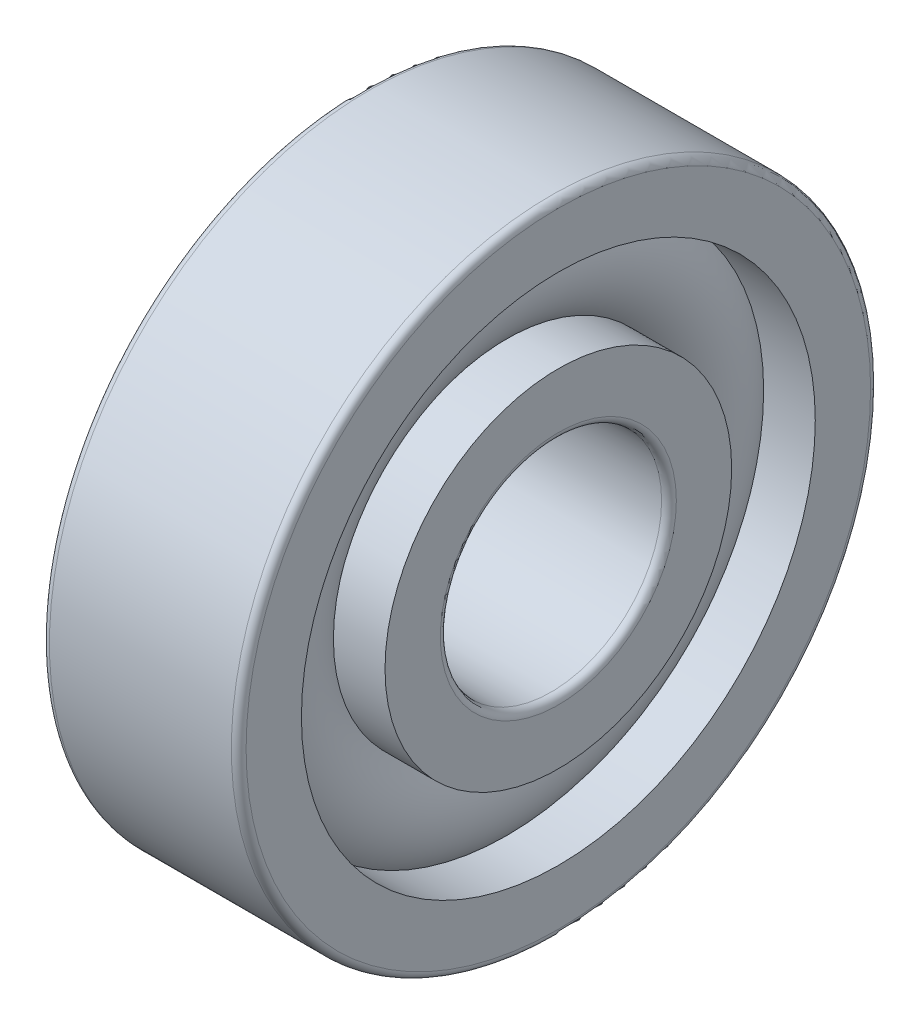
ISO-10303-21;
HEADER;
FILE_DESCRIPTION(('STEP AP214'),'2;1');
FILE_NAME('part.step','',(''),(''),'','','');
FILE_SCHEMA(('AUTOMOTIVE_DESIGN { 1 0 10303 214 1 1 1 1 }'));
ENDSEC;
DATA;
#1=APPLICATION_CONTEXT('core data for automotive mechanical design processes');
#2=APPLICATION_PROTOCOL_DEFINITION('international standard','automotive_design',2000,#1);
#3=PRODUCT_CONTEXT('',#1,'mechanical');
#4=PRODUCT('Part','Part','',(#3));
#5=PRODUCT_RELATED_PRODUCT_CATEGORY('part','',(#4));
#6=PRODUCT_DEFINITION_FORMATION('','',#4);
#7=PRODUCT_DEFINITION_CONTEXT('part definition',#1,'design');
#8=PRODUCT_DEFINITION('design','',#6,#7);
#9=PRODUCT_DEFINITION_SHAPE('','',#8);
#10=(LENGTH_UNIT() NAMED_UNIT(*) SI_UNIT(.MILLI.,.METRE.));
#11=(NAMED_UNIT(*) PLANE_ANGLE_UNIT() SI_UNIT($,.RADIAN.));
#12=(NAMED_UNIT(*) SI_UNIT($,.STERADIAN.) SOLID_ANGLE_UNIT());
#13=UNCERTAINTY_MEASURE_WITH_UNIT(LENGTH_MEASURE(1.E-05),#10,'distance_accuracy_value','');
#14=(GEOMETRIC_REPRESENTATION_CONTEXT(3) GLOBAL_UNCERTAINTY_ASSIGNED_CONTEXT((#13)) GLOBAL_UNIT_ASSIGNED_CONTEXT((#10,
#11,#12)) REPRESENTATION_CONTEXT('',''));
#15=CARTESIAN_POINT('',(0.,0.,0.));
#16=DIRECTION('',(0.,0.,1.));
#17=DIRECTION('',(1.,0.,0.));
#18=AXIS2_PLACEMENT_3D('',#15,#16,#17);
#19=CARTESIAN_POINT('',(0.,0.,0.));
#20=DIRECTION('',(-1.,0.,0.));
#21=DIRECTION('',(0.,0.,1.));
#22=AXIS2_PLACEMENT_3D('',#19,#20,#21);
#23=TOROIDAL_SURFACE('',#22,8.75,2.55);
#24=CARTESIAN_POINT('',(1.90065778087482,0.,0.));
#25=DIRECTION('',(-1.,0.,0.));
#26=DIRECTION('',(0.,0.,1.));
#27=AXIS2_PLACEMENT_3D('',#24,#25,#26);
#28=CIRCLE('',#27,10.45);
#29=CARTESIAN_POINT('',(1.90065778087482,0.,10.45));
#30=VERTEX_POINT('',#29);
#31=EDGE_CURVE('E45',#30,#30,#28,.F.);
#32=ORIENTED_EDGE('',*,*,#31,.T.);
#33=EDGE_LOOP('',(#32));
#34=FACE_BOUND('',#33,.T.);
#35=CARTESIAN_POINT('',(1.90065778087482,0.,0.));
#36=DIRECTION('',(-1.,0.,0.));
#37=DIRECTION('',(0.,0.,1.));
#38=AXIS2_PLACEMENT_3D('',#35,#36,#37);
#39=CIRCLE('',#38,7.05);
#40=CARTESIAN_POINT('',(1.90065778087482,0.,7.05));
#41=VERTEX_POINT('',#40);
#42=EDGE_CURVE('E10',#41,#41,#39,.T.);
#43=ORIENTED_EDGE('',*,*,#42,.T.);
#44=EDGE_LOOP('',(#43));
#45=FACE_BOUND('',#44,.T.);
#46=ADVANCED_FACE('F41',(#34,#45),#23,.T.);
#47=CARTESIAN_POINT('',(-20.6375,0.,0.));
#48=DIRECTION('',(1.,0.,0.));
#49=DIRECTION('',(0.,0.,-1.));
#50=AXIS2_PLACEMENT_3D('',#47,#48,#49);
#51=CYLINDRICAL_SURFACE('',#50,7.05);
#52=CARTESIAN_POINT('',(4.,0.,0.));
#53=DIRECTION('',(1.,0.,0.));
#54=DIRECTION('',(0.,0.,-1.));
#55=AXIS2_PLACEMENT_3D('',#52,#53,#54);
#56=CIRCLE('',#55,7.05);
#57=CARTESIAN_POINT('',(4.,0.,-7.05));
#58=VERTEX_POINT('',#57);
#59=EDGE_CURVE('E56',#58,#58,#56,.T.);
#60=ORIENTED_EDGE('',*,*,#59,.F.);
#61=EDGE_LOOP('',(#60));
#62=FACE_BOUND('',#61,.T.);
#63=ORIENTED_EDGE('',*,*,#42,.F.);
#64=EDGE_LOOP('',(#63));
#65=FACE_BOUND('',#64,.T.);
#66=ADVANCED_FACE('F105',(#62,#65),#51,.T.);
#67=CARTESIAN_POINT('',(-20.6375,0.,0.));
#68=DIRECTION('',(1.,0.,0.));
#69=DIRECTION('',(0.,0.,-1.));
#70=AXIS2_PLACEMENT_3D('',#67,#68,#69);
#71=CYLINDRICAL_SURFACE('',#70,7.05);
#72=CARTESIAN_POINT('',(-4.,0.,0.));
#73=DIRECTION('',(1.,0.,0.));
#74=DIRECTION('',(0.,0.,-1.));
#75=AXIS2_PLACEMENT_3D('',#72,#73,#74);
#76=CIRCLE('',#75,7.05);
#77=CARTESIAN_POINT('',(-4.,0.,-7.05));
#78=VERTEX_POINT('',#77);
#79=EDGE_CURVE('E68',#78,#78,#76,.T.);
#80=ORIENTED_EDGE('',*,*,#79,.T.);
#81=EDGE_LOOP('',(#80));
#82=FACE_BOUND('',#81,.T.);
#83=CARTESIAN_POINT('',(-1.90065778087482,0.,0.));
#84=DIRECTION('',(1.,0.,0.));
#85=DIRECTION('',(0.,0.,-1.));
#86=AXIS2_PLACEMENT_3D('',#83,#84,#85);
#87=CIRCLE('',#86,7.05);
#88=CARTESIAN_POINT('',(-1.90065778087482,0.,-7.05));
#89=VERTEX_POINT('',#88);
#90=EDGE_CURVE('E50',#89,#89,#87,.T.);
#91=ORIENTED_EDGE('',*,*,#90,.F.);
#92=EDGE_LOOP('',(#91));
#93=FACE_BOUND('',#92,.T.);
#94=ADVANCED_FACE('F108',(#82,#93),#71,.T.);
#95=CARTESIAN_POINT('',(4.,4.8,0.));
#96=DIRECTION('',(1.,0.,0.));
#97=DIRECTION('',(0.,0.,-1.));
#98=AXIS2_PLACEMENT_3D('',#95,#96,#97);
#99=PLANE('',#98);
#100=ORIENTED_EDGE('',*,*,#59,.T.);
#101=EDGE_LOOP('',(#100));
#102=FACE_BOUND('',#101,.T.);
#103=CARTESIAN_POINT('',(4.,0.,0.));
#104=DIRECTION('',(1.,0.,0.));
#105=DIRECTION('',(0.,0.,-1.));
#106=AXIS2_PLACEMENT_3D('',#103,#104,#105);
#107=CIRCLE('',#106,4.8);
#108=CARTESIAN_POINT('',(4.,0.,-4.8));
#109=VERTEX_POINT('',#108);
#110=EDGE_CURVE('E95',#109,#109,#107,.T.);
#111=ORIENTED_EDGE('',*,*,#110,.F.);
#112=EDGE_LOOP('',(#111));
#113=FACE_BOUND('',#112,.T.);
#114=ADVANCED_FACE('F102',(#102,#113),#99,.T.);
#115=CARTESIAN_POINT('',(3.7,0.,0.));
#116=DIRECTION('',(1.,0.,0.));
#117=DIRECTION('',(0.,0.,-1.));
#118=AXIS2_PLACEMENT_3D('',#115,#116,#117);
#119=TOROIDAL_SURFACE('',#118,4.8,0.299999999999999);
#120=ORIENTED_EDGE('',*,*,#110,.T.);
#121=EDGE_LOOP('',(#120));
#122=FACE_BOUND('',#121,.T.);
#123=CARTESIAN_POINT('',(3.7,0.,0.));
#124=DIRECTION('',(1.,0.,0.));
#125=DIRECTION('',(0.,0.,-1.));
#126=AXIS2_PLACEMENT_3D('',#123,#124,#125);
#127=CIRCLE('',#126,4.5);
#128=CARTESIAN_POINT('',(3.7,0.,-4.5));
#129=VERTEX_POINT('',#128);
#130=EDGE_CURVE('E91',#129,#129,#127,.T.);
#131=ORIENTED_EDGE('',*,*,#130,.F.);
#132=EDGE_LOOP('',(#131));
#133=FACE_BOUND('',#132,.T.);
#134=ADVANCED_FACE('F119',(#122,#133),#119,.T.);
#135=CARTESIAN_POINT('',(-20.6375,0.,0.));
#136=DIRECTION('',(1.,0.,0.));
#137=DIRECTION('',(0.,0.,-1.));
#138=AXIS2_PLACEMENT_3D('',#135,#136,#137);
#139=CYLINDRICAL_SURFACE('',#138,4.5);
#140=ORIENTED_EDGE('',*,*,#130,.T.);
#141=EDGE_LOOP('',(#140));
#142=FACE_BOUND('',#141,.T.);
#143=CARTESIAN_POINT('',(-3.7,0.,0.));
#144=DIRECTION('',(1.,0.,0.));
#145=DIRECTION('',(0.,0.,-1.));
#146=AXIS2_PLACEMENT_3D('',#143,#144,#145);
#147=CIRCLE('',#146,4.5);
#148=CARTESIAN_POINT('',(-3.7,0.,-4.5));
#149=VERTEX_POINT('',#148);
#150=EDGE_CURVE('E87',#149,#149,#147,.T.);
#151=ORIENTED_EDGE('',*,*,#150,.F.);
#152=EDGE_LOOP('',(#151));
#153=FACE_BOUND('',#152,.T.);
#154=ADVANCED_FACE('F122',(#142,#153),#139,.F.);
#155=CARTESIAN_POINT('',(-3.7,0.,0.));
#156=DIRECTION('',(1.,0.,0.));
#157=DIRECTION('',(0.,0.,-1.));
#158=AXIS2_PLACEMENT_3D('',#155,#156,#157);
#159=TOROIDAL_SURFACE('',#158,4.8,0.299999999999999);
#160=ORIENTED_EDGE('',*,*,#150,.T.);
#161=EDGE_LOOP('',(#160));
#162=FACE_BOUND('',#161,.T.);
#163=CARTESIAN_POINT('',(-4.,0.,0.));
#164=DIRECTION('',(1.,0.,0.));
#165=DIRECTION('',(0.,0.,-1.));
#166=AXIS2_PLACEMENT_3D('',#163,#164,#165);
#167=CIRCLE('',#166,4.8);
#168=CARTESIAN_POINT('',(-4.,0.,-4.8));
#169=VERTEX_POINT('',#168);
#170=EDGE_CURVE('E83',#169,#169,#167,.T.);
#171=ORIENTED_EDGE('',*,*,#170,.F.);
#172=EDGE_LOOP('',(#171));
#173=FACE_BOUND('',#172,.T.);
#174=ADVANCED_FACE('F126',(#162,#173),#159,.T.);
#175=CARTESIAN_POINT('',(-4.,7.05,0.));
#176=DIRECTION('',(-1.,0.,0.));
#177=DIRECTION('',(0.,0.,1.));
#178=AXIS2_PLACEMENT_3D('',#175,#176,#177);
#179=PLANE('',#178);
#180=ORIENTED_EDGE('',*,*,#170,.T.);
#181=EDGE_LOOP('',(#180));
#182=FACE_BOUND('',#181,.T.);
#183=ORIENTED_EDGE('',*,*,#79,.F.);
#184=EDGE_LOOP('',(#183));
#185=FACE_BOUND('',#184,.T.);
#186=ADVANCED_FACE('F130',(#182,#185),#179,.T.);
#187=CARTESIAN_POINT('',(-1.90065778087482,0.,0.));
#188=DIRECTION('',(1.,0.,0.));
#189=DIRECTION('',(0.,0.,-1.));
#190=AXIS2_PLACEMENT_3D('',#187,#188,#189);
#191=CIRCLE('',#190,10.45);
#192=CARTESIAN_POINT('',(-1.90065778087482,0.,-10.45));
#193=VERTEX_POINT('',#192);
#194=EDGE_CURVE('E59',#193,#193,#191,.F.);
#195=ORIENTED_EDGE('',*,*,#194,.T.);
#196=EDGE_LOOP('',(#195));
#197=FACE_BOUND('',#196,.T.);
#198=ORIENTED_EDGE('',*,*,#90,.T.);
#199=EDGE_LOOP('',(#198));
#200=FACE_BOUND('',#199,.T.);
#201=ADVANCED_FACE('F43',(#197,#200),#23,.T.);
#202=CARTESIAN_POINT('',(-20.6375,0.,0.));
#203=DIRECTION('',(1.,0.,0.));
#204=DIRECTION('',(0.,0.,-1.));
#205=AXIS2_PLACEMENT_3D('',#202,#203,#204);
#206=CYLINDRICAL_SURFACE('',#205,10.45);
#207=CARTESIAN_POINT('',(4.,0.,0.));
#208=DIRECTION('',(1.,0.,0.));
#209=DIRECTION('',(0.,0.,-1.));
#210=AXIS2_PLACEMENT_3D('',#207,#208,#209);
#211=CIRCLE('',#210,10.45);
#212=CARTESIAN_POINT('',(4.,0.,-10.45));
#213=VERTEX_POINT('',#212);
#214=EDGE_CURVE('E62',#213,#213,#211,.T.);
#215=ORIENTED_EDGE('',*,*,#214,.T.);
#216=EDGE_LOOP('',(#215));
#217=FACE_BOUND('',#216,.T.);
#218=ORIENTED_EDGE('',*,*,#31,.F.);
#219=EDGE_LOOP('',(#218));
#220=FACE_BOUND('',#219,.T.);
#221=ADVANCED_FACE('F135',(#217,#220),#206,.F.);
#222=CARTESIAN_POINT('',(-20.6375,0.,0.));
#223=DIRECTION('',(1.,0.,0.));
#224=DIRECTION('',(0.,0.,-1.));
#225=AXIS2_PLACEMENT_3D('',#222,#223,#224);
#226=CYLINDRICAL_SURFACE('',#225,10.45);
#227=CARTESIAN_POINT('',(-4.,0.,0.));
#228=DIRECTION('',(1.,0.,0.));
#229=DIRECTION('',(0.,0.,-1.));
#230=AXIS2_PLACEMENT_3D('',#227,#228,#229);
#231=CIRCLE('',#230,10.45);
#232=CARTESIAN_POINT('',(-4.,0.,-10.45));
#233=VERTEX_POINT('',#232);
#234=EDGE_CURVE('E166',#233,#233,#231,.T.);
#235=ORIENTED_EDGE('',*,*,#234,.F.);
#236=EDGE_LOOP('',(#235));
#237=FACE_BOUND('',#236,.T.);
#238=ORIENTED_EDGE('',*,*,#194,.F.);
#239=EDGE_LOOP('',(#238));
#240=FACE_BOUND('',#239,.T.);
#241=ADVANCED_FACE('F138',(#237,#240),#226,.F.);
#242=CARTESIAN_POINT('',(4.,12.7,0.));
#243=DIRECTION('',(1.,0.,0.));
#244=DIRECTION('',(0.,0.,-1.));
#245=AXIS2_PLACEMENT_3D('',#242,#243,#244);
#246=PLANE('',#245);
#247=CARTESIAN_POINT('',(4.,0.,0.));
#248=DIRECTION('',(1.,0.,0.));
#249=DIRECTION('',(0.,0.,-1.));
#250=AXIS2_PLACEMENT_3D('',#247,#248,#249);
#251=CIRCLE('',#250,12.7);
#252=CARTESIAN_POINT('',(4.,0.,-12.7));
#253=VERTEX_POINT('',#252);
#254=EDGE_CURVE('E70',#253,#253,#251,.T.);
#255=ORIENTED_EDGE('',*,*,#254,.T.);
#256=EDGE_LOOP('',(#255));
#257=FACE_BOUND('',#256,.T.);
#258=ORIENTED_EDGE('',*,*,#214,.F.);
#259=EDGE_LOOP('',(#258));
#260=FACE_BOUND('',#259,.T.);
#261=ADVANCED_FACE('F139',(#257,#260),#246,.T.);
#262=CARTESIAN_POINT('',(3.7,0.,0.));
#263=DIRECTION('',(1.,0.,0.));
#264=DIRECTION('',(0.,0.,-1.));
#265=AXIS2_PLACEMENT_3D('',#262,#263,#264);
#266=TOROIDAL_SURFACE('',#265,12.7,0.299999999999999);
#267=CARTESIAN_POINT('',(3.7,0.,0.));
#268=DIRECTION('',(1.,0.,0.));
#269=DIRECTION('',(0.,0.,-1.));
#270=AXIS2_PLACEMENT_3D('',#267,#268,#269);
#271=CIRCLE('',#270,13.);
#272=CARTESIAN_POINT('',(3.7,0.,-13.));
#273=VERTEX_POINT('',#272);
#274=EDGE_CURVE('E76',#273,#273,#271,.T.);
#275=ORIENTED_EDGE('',*,*,#274,.T.);
#276=EDGE_LOOP('',(#275));
#277=FACE_BOUND('',#276,.T.);
#278=ORIENTED_EDGE('',*,*,#254,.F.);
#279=EDGE_LOOP('',(#278));
#280=FACE_BOUND('',#279,.T.);
#281=ADVANCED_FACE('F142',(#277,#280),#266,.T.);
#282=CARTESIAN_POINT('',(-20.6375,0.,0.));
#283=DIRECTION('',(1.,0.,0.));
#284=DIRECTION('',(0.,0.,-1.));
#285=AXIS2_PLACEMENT_3D('',#282,#283,#284);
#286=CYLINDRICAL_SURFACE('',#285,13.);
#287=CARTESIAN_POINT('',(-3.7,0.,0.));
#288=DIRECTION('',(1.,0.,0.));
#289=DIRECTION('',(0.,0.,-1.));
#290=AXIS2_PLACEMENT_3D('',#287,#288,#289);
#291=CIRCLE('',#290,13.);
#292=CARTESIAN_POINT('',(-3.7,0.,-13.));
#293=VERTEX_POINT('',#292);
#294=EDGE_CURVE('E172',#293,#293,#291,.T.);
#295=ORIENTED_EDGE('',*,*,#294,.T.);
#296=EDGE_LOOP('',(#295));
#297=FACE_BOUND('',#296,.T.);
#298=ORIENTED_EDGE('',*,*,#274,.F.);
#299=EDGE_LOOP('',(#298));
#300=FACE_BOUND('',#299,.T.);
#301=ADVANCED_FACE('F146',(#297,#300),#286,.T.);
#302=CARTESIAN_POINT('',(-3.7,0.,0.));
#303=DIRECTION('',(1.,0.,0.));
#304=DIRECTION('',(0.,0.,-1.));
#305=AXIS2_PLACEMENT_3D('',#302,#303,#304);
#306=TOROIDAL_SURFACE('',#305,12.7,0.299999999999999);
#307=CARTESIAN_POINT('',(-4.,0.,0.));
#308=DIRECTION('',(1.,0.,0.));
#309=DIRECTION('',(0.,0.,-1.));
#310=AXIS2_PLACEMENT_3D('',#307,#308,#309);
#311=CIRCLE('',#310,12.7);
#312=CARTESIAN_POINT('',(-4.,0.,-12.7));
#313=VERTEX_POINT('',#312);
#314=EDGE_CURVE('E168',#313,#313,#311,.T.);
#315=ORIENTED_EDGE('',*,*,#314,.T.);
#316=EDGE_LOOP('',(#315));
#317=FACE_BOUND('',#316,.T.);
#318=ORIENTED_EDGE('',*,*,#294,.F.);
#319=EDGE_LOOP('',(#318));
#320=FACE_BOUND('',#319,.T.);
#321=ADVANCED_FACE('F150',(#317,#320),#306,.T.);
#322=CARTESIAN_POINT('',(-4.,10.45,0.));
#323=DIRECTION('',(-1.,0.,0.));
#324=DIRECTION('',(0.,0.,1.));
#325=AXIS2_PLACEMENT_3D('',#322,#323,#324);
#326=PLANE('',#325);
#327=ORIENTED_EDGE('',*,*,#234,.T.);
#328=EDGE_LOOP('',(#327));
#329=FACE_BOUND('',#328,.T.);
#330=ORIENTED_EDGE('',*,*,#314,.F.);
#331=EDGE_LOOP('',(#330));
#332=FACE_BOUND('',#331,.T.);
#333=ADVANCED_FACE('F154',(#329,#332),#326,.T.);
#334=CLOSED_SHELL('',(#46,#66,#94,#114,#134,#154,#174,#186,#201,#221,#241,#261,#281,#301,#321,#333));
#335=MANIFOLD_SOLID_BREP('B2',#334);
#336=ADVANCED_BREP_SHAPE_REPRESENTATION('',(#18,#335),#14);
#337=SHAPE_DEFINITION_REPRESENTATION(#9,#336);
ENDSEC;
END-ISO-10303-21;
